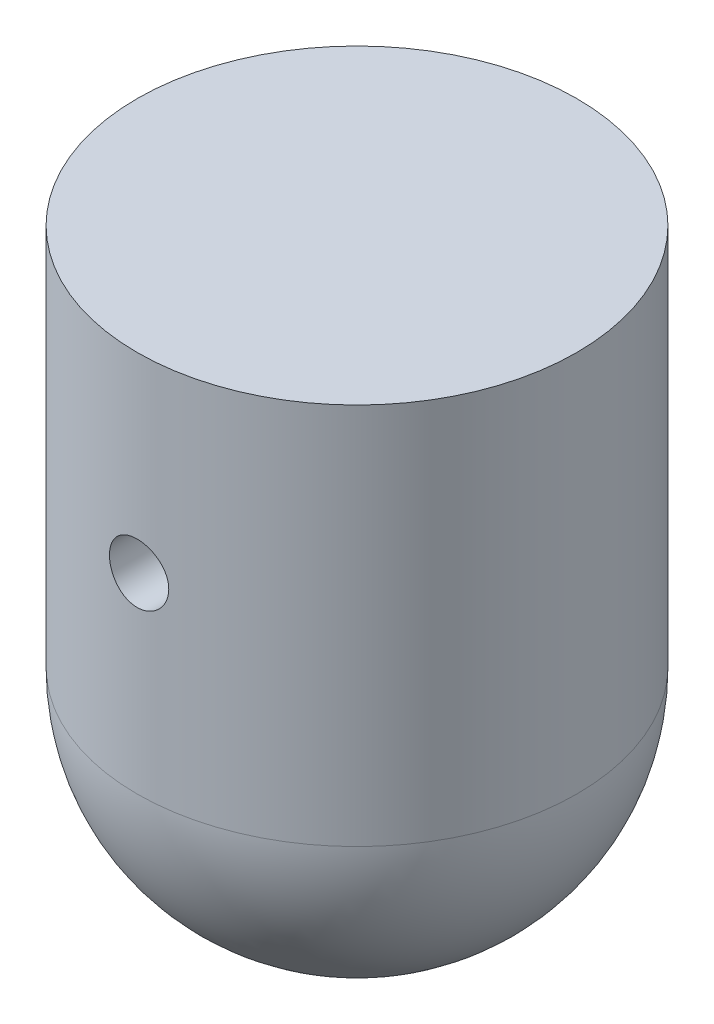
ISO-10303-21;
HEADER;
FILE_DESCRIPTION(('STEP AP214'),'2;1');
FILE_NAME('part.step','',(''),(''),'','','');
FILE_SCHEMA(('AUTOMOTIVE_DESIGN { 1 0 10303 214 1 1 1 1 }'));
ENDSEC;
DATA;
#1=APPLICATION_CONTEXT('core data for automotive mechanical design processes');
#2=APPLICATION_PROTOCOL_DEFINITION('international standard','automotive_design',2000,#1);
#3=PRODUCT_CONTEXT('',#1,'mechanical');
#4=PRODUCT('Part','Part','',(#3));
#5=PRODUCT_RELATED_PRODUCT_CATEGORY('part','',(#4));
#6=PRODUCT_DEFINITION_FORMATION('','',#4);
#7=PRODUCT_DEFINITION_CONTEXT('part definition',#1,'design');
#8=PRODUCT_DEFINITION('design','',#6,#7);
#9=PRODUCT_DEFINITION_SHAPE('','',#8);
#10=(LENGTH_UNIT() NAMED_UNIT(*) SI_UNIT(.MILLI.,.METRE.));
#11=(NAMED_UNIT(*) PLANE_ANGLE_UNIT() SI_UNIT($,.RADIAN.));
#12=(NAMED_UNIT(*) SI_UNIT($,.STERADIAN.) SOLID_ANGLE_UNIT());
#13=UNCERTAINTY_MEASURE_WITH_UNIT(LENGTH_MEASURE(1.E-05),#10,'distance_accuracy_value','');
#14=(GEOMETRIC_REPRESENTATION_CONTEXT(3) GLOBAL_UNCERTAINTY_ASSIGNED_CONTEXT((#13)) GLOBAL_UNIT_ASSIGNED_CONTEXT((#10,
#11,#12)) REPRESENTATION_CONTEXT('',''));
#15=CARTESIAN_POINT('',(0.,0.,0.));
#16=DIRECTION('',(0.,0.,1.));
#17=DIRECTION('',(1.,0.,0.));
#18=AXIS2_PLACEMENT_3D('',#15,#16,#17);
#19=CARTESIAN_POINT('',(-1.39659253553725E-13,20.,0.));
#20=DIRECTION('',(0.,-1.,0.));
#21=DIRECTION('',(1.,0.,0.));
#22=AXIS2_PLACEMENT_3D('',#19,#20,#21);
#23=CYLINDRICAL_SURFACE('',#22,11.5);
#24=CARTESIAN_POINT('',(0.,8.45000000000008,-11.5));
#25=CARTESIAN_POINT('',(0.0866428978733283,8.45000364376348,-11.4999987163886));
#26=CARTESIAN_POINT('',(0.173338510622883,8.45728933782402,-11.4990105151674));
#27=CARTESIAN_POINT('',(0.34431328457875,8.48623611754324,-11.4951634569416));
#28=CARTESIAN_POINT('',(0.428589894347276,8.50791183891256,-11.4923026954478));
#29=CARTESIAN_POINT('',(0.592227018688076,8.56498501338923,-11.4850325032003));
#30=CARTESIAN_POINT('',(0.671590948186435,8.60037280779753,-11.4806241627565));
#31=CARTESIAN_POINT('',(0.823239825609689,8.68384351941831,-11.4707479303287));
#32=CARTESIAN_POINT('',(0.895525899249772,8.73192441331432,-11.4652802072502));
#33=CARTESIAN_POINT('',(1.03144094143677,8.83974302478841,-11.4538558809928));
#34=CARTESIAN_POINT('',(1.09501837709979,8.8995454352154,-11.4478966760981));
#35=CARTESIAN_POINT('',(1.2112672848125,9.02897044809276,-11.4361817727578));
#36=CARTESIAN_POINT('',(1.26393817564616,9.09859357356246,-11.4304260851714));
#37=CARTESIAN_POINT('',(1.35707418044255,9.24602298403573,-11.4197444684231));
#38=CARTESIAN_POINT('',(1.39749040311266,9.32386041953598,-11.414821896672));
#39=CARTESIAN_POINT('',(1.46465750084194,9.48529560413313,-11.406398697008));
#40=CARTESIAN_POINT('',(1.49140897711694,9.56889309961763,-11.4028980065371));
#41=CARTESIAN_POINT('',(1.53032926283156,9.73893763528823,-11.3977400980162));
#42=CARTESIAN_POINT('',(1.54258557621056,9.82536430596658,-11.396071822506));
#43=CARTESIAN_POINT('',(1.55243850854337,9.99906259001316,-11.3947339098974));
#44=CARTESIAN_POINT('',(1.5500358098942,10.0863341638612,-11.395064179764));
#45=CARTESIAN_POINT('',(1.53071063164254,10.2586320505768,-11.3976759233191));
#46=CARTESIAN_POINT('',(1.51388493351534,10.343669443902,-11.3999443909477));
#47=CARTESIAN_POINT('',(1.46634256351911,10.5097027292705,-11.4061566365759));
#48=CARTESIAN_POINT('',(1.43562556859723,10.5906985272747,-11.4101004535369));
#49=CARTESIAN_POINT('',(1.36106977430501,10.7466478142788,-11.4192336394168));
#50=CARTESIAN_POINT('',(1.31718931262422,10.8215811450518,-11.4244269524973));
#51=CARTESIAN_POINT('',(1.21758194301051,10.9630573846504,-11.4354710062963));
#52=CARTESIAN_POINT('',(1.16185440573773,11.0295998474373,-11.4413217819327));
#53=CARTESIAN_POINT('',(1.03960031089619,11.1529669001635,-11.4530792198419));
#54=CARTESIAN_POINT('',(0.972990409387543,11.2097089239264,-11.4589859527679));
#55=CARTESIAN_POINT('',(0.831148278955995,11.3112201891634,-11.4701458144019));
#56=CARTESIAN_POINT('',(0.755916024239377,11.3559893948195,-11.4753989411546));
#57=CARTESIAN_POINT('',(0.59889816197262,11.4322857927703,-11.4846637442058));
#58=CARTESIAN_POINT('',(0.51710979373483,11.4638073714254,-11.4886748940314));
#59=CARTESIAN_POINT('',(0.349334656100912,11.5126458896649,-11.4949991816484));
#60=CARTESIAN_POINT('',(0.263348115725708,11.5299636031908,-11.4973124119555));
#61=CARTESIAN_POINT('',(0.0903308960810676,11.5497947657113,-11.4999681148013));
#62=CARTESIAN_POINT('',(0.00331346704912377,11.5524218684346,-11.5003257165596));
#63=CARTESIAN_POINT('',(-0.169920500301108,11.5430978127317,-11.4990708428393));
#64=CARTESIAN_POINT('',(-0.256137058467361,11.5311470165657,-11.497458416316));
#65=CARTESIAN_POINT('',(-0.424983258846822,11.4931008601108,-11.492454049421));
#66=CARTESIAN_POINT('',(-0.507625431821476,11.4670601290534,-11.4890689835138));
#67=CARTESIAN_POINT('',(-0.66737016356948,11.4016303998939,-11.4808980463445));
#68=CARTESIAN_POINT('',(-0.744472506704762,11.3622408825307,-11.4761121205906));
#69=CARTESIAN_POINT('',(-0.891453629458274,11.2709598202343,-11.4656346733335));
#70=CARTESIAN_POINT('',(-0.961286698924614,11.2189952822319,-11.4599379329346));
#71=CARTESIAN_POINT('',(-1.09128085643535,11.1041419136188,-11.4482912966458));
#72=CARTESIAN_POINT('',(-1.15144149511864,11.0412525757468,-11.4423413890106));
#73=CARTESIAN_POINT('',(-1.26079012857458,10.9058321471959,-11.4308118444198));
#74=CARTESIAN_POINT('',(-1.30990246360183,10.8332396966426,-11.4252349340754));
#75=CARTESIAN_POINT('',(-1.39523649918246,10.6807692835329,-11.4151289684536));
#76=CARTESIAN_POINT('',(-1.43145849278096,10.6008914866513,-11.410599889356));
#77=CARTESIAN_POINT('',(-1.4898630662442,10.4363550698906,-11.4031214274329));
#78=CARTESIAN_POINT('',(-1.512087248077,10.3517114389879,-11.4001673676526));
#79=CARTESIAN_POINT('',(-1.54199876847599,10.1798509784155,-11.3961603765188));
#80=CARTESIAN_POINT('',(-1.54968690301076,10.0926342899075,-11.3951073410687));
#81=CARTESIAN_POINT('',(-1.5502918786119,9.91885666086418,-11.3950249877507));
#82=CARTESIAN_POINT('',(-1.54332761195837,9.83229611811893,-11.3959793812177));
#83=CARTESIAN_POINT('',(-1.51507835798589,9.66158835849651,-11.3997691903086));
#84=CARTESIAN_POINT('',(-1.49379337735525,9.57744114049225,-11.402604605054));
#85=CARTESIAN_POINT('',(-1.4375459149424,9.41397075991725,-11.40983169534));
#86=CARTESIAN_POINT('',(-1.40259012726714,9.33464525825582,-11.4142226091092));
#87=CARTESIAN_POINT('',(-1.32000500515248,9.18296621475364,-11.4240670763154));
#88=CARTESIAN_POINT('',(-1.27237541061872,9.11061281603727,-11.4295206515599));
#89=CARTESIAN_POINT('',(-1.16535683817364,8.97432532227824,-11.4409288746495));
#90=CARTESIAN_POINT('',(-1.10587941831558,8.91046096757395,-11.446887084581));
#91=CARTESIAN_POINT('',(-0.977039485106418,8.79357543476775,-11.458602406755));
#92=CARTESIAN_POINT('',(-0.907674658071495,8.7405568016894,-11.4643594715354));
#93=CARTESIAN_POINT('',(-0.760673567838305,8.64666414803256,-11.4750523401042));
#94=CARTESIAN_POINT('',(-0.68300213833245,8.60584477935579,-11.4799844058083));
#95=CARTESIAN_POINT('',(-0.521880846184165,8.53788894812447,-11.488434282738));
#96=CARTESIAN_POINT('',(-0.438437263094482,8.51073787397727,-11.4919536033881));
#97=CARTESIAN_POINT('',(-0.295485298485994,8.4772637348094,-11.4963496279065));
#98=CARTESIAN_POINT('',(-0.23687178121749,8.46705486738808,-11.4977117161153));
#99=CARTESIAN_POINT('',(-0.118847106631597,8.45342178104791,-11.4995373383467));
#100=CARTESIAN_POINT('',(-0.0594359565736047,8.44999750042344,-11.5000008805415));
#101=CARTESIAN_POINT('',(0.,8.45000000000008,-11.5));
#102=B_SPLINE_CURVE_WITH_KNOTS('',3,(#24,#25,#26,#27,#28,#29,#30,#31,#32,#33,#34,#35,#36,#37,
#38,#39,#40,#41,#42,#43,#44,#45,#46,#47,#48,#49,#50,#51,#52,#53,#54,#55,#56,#57,#58,#59,#60,#61,
#62,#63,#64,#65,#66,#67,#68,#69,#70,#71,#72,#73,#74,#75,#76,#77,#78,#79,#80,#81,#82,#83,#84,#85,
#86,#87,#88,#89,#90,#91,#92,#93,#94,#95,#96,#97,#98,#99,#100,#101),.UNSPECIFIED.,.T.,.F.,(4,2,2,
2,2,2,2,2,2,2,2,2,2,2,2,2,2,2,2,2,2,2,2,2,2,2,2,2,2,2,2,2,2,2,2,2,2,2,4),(0.,0.259711562319687,
0.519687675806871,0.7794809956635,1.03923292869845,1.30046103112698,1.56170305097049,
1.82397401020357,2.08623342915418,2.34690143361449,2.60755730371579,2.86647768647041,
3.12540409092835,3.38515880102377,3.64492731324763,3.90678756828743,4.16864860670107,
4.4306204962884,4.69257811057907,4.95250625936968,5.21242794908706,5.47134902210946,
5.73028016818967,5.99075196518859,6.25123585967367,6.51345266258869,6.7756635039656,
7.03709132229067,7.29850482487021,7.5578053539055,7.81710576183775,8.07627935825663,
8.33545827389749,8.59664976490173,8.85790247616549,9.12030861786777,9.38243364496977,
9.56059418567571,9.73875310600912),.UNSPECIFIED.);
#103=CARTESIAN_POINT('',(0.,8.45000000000008,-11.5));
#104=VERTEX_POINT('',#103);
#105=EDGE_CURVE('E10',#104,#104,#102,.T.);
#106=ORIENTED_EDGE('',*,*,#105,.T.);
#107=EDGE_LOOP('',(#106));
#108=FACE_BOUND('',#107,.T.);
#109=CARTESIAN_POINT('',(1.55,10.0000000000001,11.3950647211852));
#110=CARTESIAN_POINT('',(1.54999635272623,9.91336113191974,11.3950660490933));
#111=CARTESIAN_POINT('',(1.5427113134957,9.8266695375021,11.3960634970969));
#112=CARTESIAN_POINT('',(1.51376737096541,9.65570311143409,11.3999435679442));
#113=CARTESIAN_POINT('',(1.49209381762945,9.57143083440271,11.4028281121399));
#114=CARTESIAN_POINT('',(1.43502698420188,9.40780287560253,11.410149856961));
#115=CARTESIAN_POINT('',(1.39964346551608,9.3284437422277,11.4145859526737));
#116=CARTESIAN_POINT('',(1.3161828257894,9.17680291520954,11.424509641484));
#117=CARTESIAN_POINT('',(1.26810771772358,9.10452010170234,11.4299970677954));
#118=CARTESIAN_POINT('',(1.16029497533588,8.9686014366372,11.4414449584631));
#119=CARTESIAN_POINT('',(1.10049135334953,8.90501813681631,11.4474079804517));
#120=CARTESIAN_POINT('',(0.97106144733606,8.78875789443811,11.4591122484821));
#121=CARTESIAN_POINT('',(0.901434656375081,8.73608151508907,11.4648534830591));
#122=CARTESIAN_POINT('',(0.75400197632626,8.64293972448258,11.4754937150761));
#123=CARTESIAN_POINT('',(0.676165567365666,8.60252220924572,11.4803893775669));
#124=CARTESIAN_POINT('',(0.514732611993868,8.53535243946901,11.4887586590632));
#125=CARTESIAN_POINT('',(0.43113631290841,8.50859959859187,11.4922323390831));
#126=CARTESIAN_POINT('',(0.261095676681304,8.46967652990423,11.4973482396015));
#127=CARTESIAN_POINT('',(0.174671738579055,8.45741865564424,11.4990014635909));
#128=CARTESIAN_POINT('',(0.000978822372901293,8.44756165451604,11.5003278066436));
#129=CARTESIAN_POINT('',(-0.0862901172173021,8.44996186266864,11.5000010155323));
#130=CARTESIAN_POINT('',(-0.258598861340663,8.46928305100606,11.4974130100501));
#131=CARTESIAN_POINT('',(-0.343649452041199,8.48610975851484,11.4951643547606));
#132=CARTESIAN_POINT('',(-0.509708609180633,8.53365870360604,11.4889993241823));
#133=CARTESIAN_POINT('',(-0.590717088365379,8.56438124100378,11.4850829129103));
#134=CARTESIAN_POINT('',(-0.746681929138028,8.63894860655327,11.4760007716346));
#135=CARTESIAN_POINT('',(-0.821618750095802,8.68283381969546,11.4708312062722));
#136=CARTESIAN_POINT('',(-0.963099964431222,8.78245138173123,11.4598203133346));
#137=CARTESIAN_POINT('',(-1.02964391039511,8.83818436178962,11.4539789499784));
#138=CARTESIAN_POINT('',(-1.15300499113638,8.96044237650203,11.4422225722344));
#139=CARTESIAN_POINT('',(-1.20974065332119,9.02704962921845,11.4363073414006));
#140=CARTESIAN_POINT('',(-1.31124033678633,9.1688841725736,11.4251155113826));
#141=CARTESIAN_POINT('',(-1.3560043086656,9.24411149878114,11.4198389148338));
#142=CARTESIAN_POINT('',(-1.43229691705139,9.40112790380983,11.410521929517));
#143=CARTESIAN_POINT('',(-1.46381834560404,9.48292052736887,11.4064822143106));
#144=CARTESIAN_POINT('',(-1.51265526527616,9.65070493246682,11.4001090447335));
#145=CARTESIAN_POINT('',(-1.52997155690737,9.73669647709167,11.397775494215));
#146=CARTESIAN_POINT('',(-1.54979734375686,9.90971621631813,11.3950967139683));
#147=CARTESIAN_POINT('',(-1.55242180442709,9.99673100716337,11.3947360466873));
#148=CARTESIAN_POINT('',(-1.54309340613775,10.1699590680578,11.396002984719));
#149=CARTESIAN_POINT('',(-1.53114090989524,10.2561723579968,11.397630540559));
#150=CARTESIAN_POINT('',(-1.49309494968722,10.4250013190543,11.4026764202886));
#151=CARTESIAN_POINT('',(-1.46705774796646,10.5076299004581,11.4060876175115));
#152=CARTESIAN_POINT('',(-1.40163961668558,10.6673490057789,11.4143106138742));
#153=CARTESIAN_POINT('',(-1.36225814683559,10.7444393053058,11.4191224697234));
#154=CARTESIAN_POINT('',(-1.27098910288165,10.8914119106355,11.4296413678127));
#155=CARTESIAN_POINT('',(-1.21902649591877,10.9612472361374,11.4353537063173));
#156=CARTESIAN_POINT('',(-1.10417561756745,11.091246841796,11.4470135650924));
#157=CARTESIAN_POINT('',(-1.0412868504138,11.1514106828788,11.4529610960251));
#158=CARTESIAN_POINT('',(-0.905865091262138,11.2607666824062,11.4644689387942));
#159=CARTESIAN_POINT('',(-0.833270624475566,11.3098830557602,11.470026406159));
#160=CARTESIAN_POINT('',(-0.680795059345668,11.3952241704143,11.4800848159658));
#161=CARTESIAN_POINT('',(-0.600914127979383,11.4314492070398,11.4845857826103));
#162=CARTESIAN_POINT('',(-0.436379329578039,11.4898556995944,11.492011493375));
#163=CARTESIAN_POINT('',(-0.35174092442011,11.5120800751703,11.494941050578));
#164=CARTESIAN_POINT('',(-0.179891521170142,11.5419937521775,11.4989139316491));
#165=CARTESIAN_POINT('',(-0.0926806591936194,11.5496838212615,11.4999573551361));
#166=CARTESIAN_POINT('',(0.0810999457663529,11.5502946232098,11.5000397393278));
#167=CARTESIAN_POINT('',(0.167669294632003,11.5433318736865,11.4990945135701));
#168=CARTESIAN_POINT('',(0.338395055461716,11.5150825641499,11.4953373966527));
#169=CARTESIAN_POINT('',(0.422551471130934,11.4937960261326,11.4925255083595));
#170=CARTESIAN_POINT('',(0.586040949842424,11.4375417792893,11.4853495309952));
#171=CARTESIAN_POINT('',(0.665376288939012,11.4025805852311,11.4809861811486));
#172=CARTESIAN_POINT('',(0.817072764379748,11.319981591165,11.4711889839129));
#173=CARTESIAN_POINT('',(0.889433763718176,11.272343542199,11.4657551155006));
#174=CARTESIAN_POINT('',(1.02572133610882,11.1653154526721,11.4543710039359));
#175=CARTESIAN_POINT('',(1.08957968761126,11.1058389175614,11.4484171529104));
#176=CARTESIAN_POINT('',(1.20645352017496,10.9770032533095,11.4366922310034));
#177=CARTESIAN_POINT('',(1.25946644020434,10.9076417964958,11.4309212035651));
#178=CARTESIAN_POINT('',(1.35335268726105,10.7606436650695,11.4201876604833));
#179=CARTESIAN_POINT('',(1.39417040179939,10.6829712106382,11.4152288939235));
#180=CARTESIAN_POINT('',(1.46212285978654,10.5218477922881,11.4067252038895));
#181=CARTESIAN_POINT('',(1.48927223392189,10.4384031163232,11.4031787694988));
#182=CARTESIAN_POINT('',(1.52274176670819,10.2954556602396,11.3987470696035));
#183=CARTESIAN_POINT('',(1.5329485624663,10.2368480665962,11.3973732281358));
#184=CARTESIAN_POINT('',(1.54657889814034,10.1188352467197,11.3955316027473));
#185=CARTESIAN_POINT('',(1.55000250185151,10.0594300279934,11.3950638103052));
#186=CARTESIAN_POINT('',(1.55,10.0000000000001,11.3950647211852));
#187=B_SPLINE_CURVE_WITH_KNOTS('',3,(#109,#110,#111,#112,#113,#114,#115,#116,#117,#118,#119,
#120,#121,#122,#123,#124,#125,#126,#127,#128,#129,#130,#131,#132,#133,#134,#135,#136,#137,#138,
#139,#140,#141,#142,#143,#144,#145,#146,#147,#148,#149,#150,#151,#152,#153,#154,#155,#156,#157,
#158,#159,#160,#161,#162,#163,#164,#165,#166,#167,#168,#169,#170,#171,#172,#173,#174,#175,#176,
#177,#178,#179,#180,#181,#182,#183,#184,#185,#186),.UNSPECIFIED.,.T.,.F.,(4,2,2,2,2,2,2,2,2,2,2,
2,2,2,2,2,2,2,2,2,2,2,2,2,2,2,2,2,2,2,2,2,2,2,2,2,2,2,4),(0.,0.259699455485353,
0.519663737030214,0.779443264818907,1.03918161448199,1.3004255638344,1.56168299986087,
1.82394840976763,2.08620256518673,2.34686270981205,2.6075110294059,2.86646896354139,
3.12543248519917,3.38519881645652,3.64497898968697,3.90682293867736,4.16866796814772,
4.43065533653198,4.6926279399492,4.95254767800141,5.212460948627,5.47134356454541,
5.73023666349443,5.99071355326302,6.25120226503671,6.51342682906433,6.77564538544773,
7.03705613671561,7.29845308077179,7.55777928205016,7.81710508510145,8.07630749246473,
8.33551499062924,8.59669084370201,8.85792829963356,9.12033947729905,9.38246916781029,
9.56061197378241,9.73875310433177),.UNSPECIFIED.);
#188=CARTESIAN_POINT('',(1.55,10.0000000000001,11.3950647211852));
#189=VERTEX_POINT('',#188);
#190=EDGE_CURVE('E49',#189,#189,#187,.T.);
#191=ORIENTED_EDGE('',*,*,#190,.T.);
#192=EDGE_LOOP('',(#191));
#193=FACE_BOUND('',#192,.T.);
#194=CARTESIAN_POINT('',(-1.39659253553725E-13,20.,0.));
#195=DIRECTION('',(0.,1.,0.));
#196=DIRECTION('',(-1.,0.,0.));
#197=AXIS2_PLACEMENT_3D('',#194,#195,#196);
#198=CIRCLE('',#197,11.5);
#199=CARTESIAN_POINT('',(-11.5000000000001,19.9999999999999,0.));
#200=VERTEX_POINT('',#199);
#201=EDGE_CURVE('E54',#200,#200,#198,.T.);
#202=ORIENTED_EDGE('',*,*,#201,.F.);
#203=EDGE_LOOP('',(#202));
#204=FACE_BOUND('',#203,.T.);
#205=CARTESIAN_POINT('',(0.,0.,0.));
#206=DIRECTION('',(0.,1.,0.));
#207=DIRECTION('',(-1.,0.,0.));
#208=AXIS2_PLACEMENT_3D('',#205,#206,#207);
#209=CIRCLE('',#208,11.5);
#210=CARTESIAN_POINT('',(-11.5,0.,0.));
#211=VERTEX_POINT('',#210);
#212=EDGE_CURVE('E59',#211,#211,#209,.T.);
#213=ORIENTED_EDGE('',*,*,#212,.T.);
#214=EDGE_LOOP('',(#213));
#215=FACE_BOUND('',#214,.T.);
#216=ADVANCED_FACE('F37',(#108,#193,#204,#215),#23,.T.);
#217=CARTESIAN_POINT('',(-1.39659253553725E-13,20.,0.));
#218=DIRECTION('',(0.,1.,0.));
#219=DIRECTION('',(-1.,0.,0.));
#220=AXIS2_PLACEMENT_3D('',#217,#218,#219);
#221=PLANE('',#220);
#222=ORIENTED_EDGE('',*,*,#201,.T.);
#223=EDGE_LOOP('',(#222));
#224=FACE_BOUND('',#223,.T.);
#225=ADVANCED_FACE('F71',(#224),#221,.T.);
#226=CARTESIAN_POINT('',(0.,0.,0.));
#227=DIRECTION('',(0.,0.,-1.));
#228=DIRECTION('',(-1.,0.,0.));
#229=AXIS2_PLACEMENT_3D('',#226,#227,#228);
#230=SPHERICAL_SURFACE('',#229,11.5);
#231=CARTESIAN_POINT('',(0.,0.,0.));
#232=DIRECTION('',(0.,1.,0.));
#233=DIRECTION('',(-1.,0.,0.));
#234=AXIS2_PLACEMENT_3D('',#231,#232,#233);
#235=SPHERICAL_SURFACE('',#234,11.5);
#236=ORIENTED_EDGE('',*,*,#212,.F.);
#237=EDGE_LOOP('',(#236));
#238=FACE_BOUND('',#237,.T.);
#239=ADVANCED_FACE('F39',(#238),#235,.T.);
#240=CARTESIAN_POINT('',(0.,10.0000000000001,-11.5));
#241=DIRECTION('',(0.,0.,1.));
#242=DIRECTION('',(1.,0.,0.));
#243=AXIS2_PLACEMENT_3D('',#240,#241,#242);
#244=CYLINDRICAL_SURFACE('',#243,1.55);
#245=ORIENTED_EDGE('',*,*,#190,.F.);
#246=EDGE_LOOP('',(#245));
#247=FACE_BOUND('',#246,.T.);
#248=ORIENTED_EDGE('',*,*,#105,.F.);
#249=EDGE_LOOP('',(#248));
#250=FACE_BOUND('',#249,.T.);
#251=ADVANCED_FACE('F67',(#247,#250),#244,.F.);
#252=CLOSED_SHELL('',(#216,#225,#239,#251));
#253=MANIFOLD_SOLID_BREP('B2',#252);
#254=ADVANCED_BREP_SHAPE_REPRESENTATION('',(#18,#253),#14);
#255=SHAPE_DEFINITION_REPRESENTATION(#9,#254);
ENDSEC;
END-ISO-10303-21;
